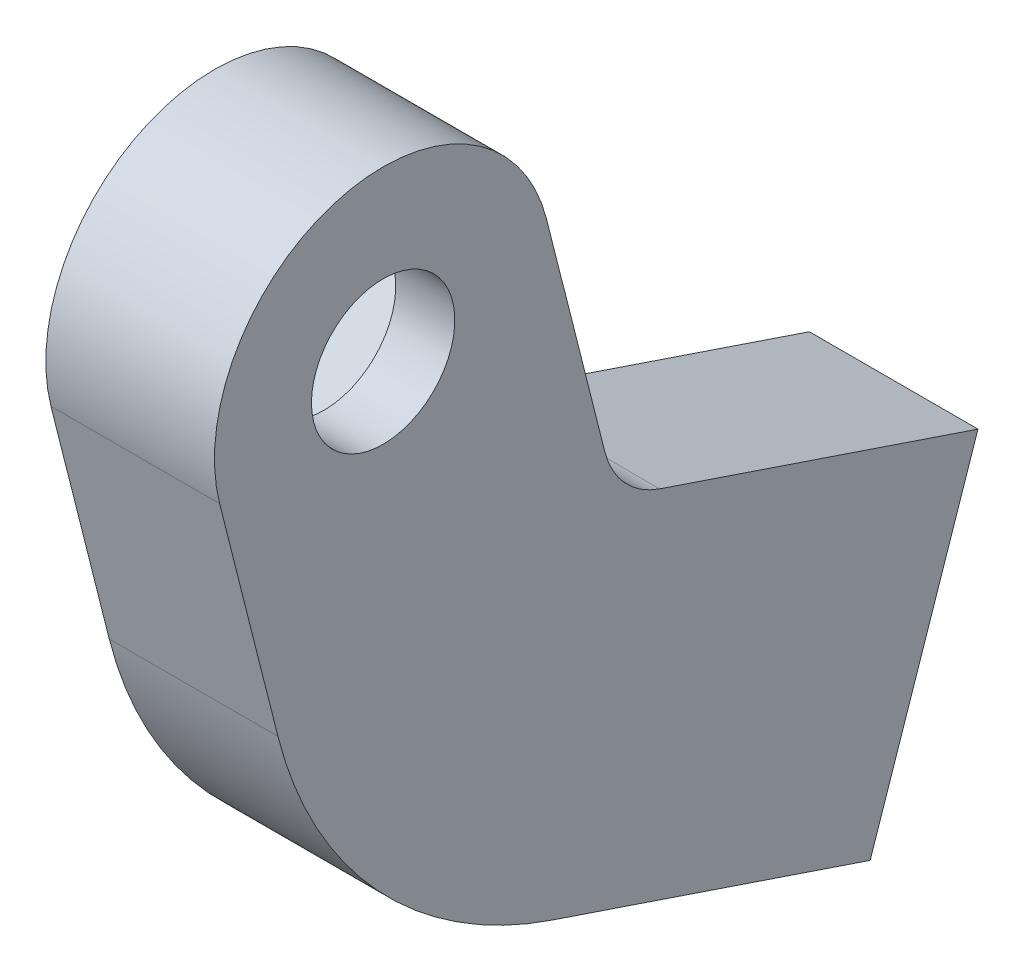
ISO-10303-21;
HEADER;
FILE_DESCRIPTION(('STEP AP214'),'2;1');
FILE_NAME('part.step','',(''),(''),'','','');
FILE_SCHEMA(('AUTOMOTIVE_DESIGN { 1 0 10303 214 1 1 1 1 }'));
ENDSEC;
DATA;
#1=APPLICATION_CONTEXT('core data for automotive mechanical design processes');
#2=APPLICATION_PROTOCOL_DEFINITION('international standard','automotive_design',2000,#1);
#3=PRODUCT_CONTEXT('',#1,'mechanical');
#4=PRODUCT('Part','Part','',(#3));
#5=PRODUCT_RELATED_PRODUCT_CATEGORY('part','',(#4));
#6=PRODUCT_DEFINITION_FORMATION('','',#4);
#7=PRODUCT_DEFINITION_CONTEXT('part definition',#1,'design');
#8=PRODUCT_DEFINITION('design','',#6,#7);
#9=PRODUCT_DEFINITION_SHAPE('','',#8);
#10=(LENGTH_UNIT() NAMED_UNIT(*) SI_UNIT(.MILLI.,.METRE.));
#11=(NAMED_UNIT(*) PLANE_ANGLE_UNIT() SI_UNIT($,.RADIAN.));
#12=(NAMED_UNIT(*) SI_UNIT($,.STERADIAN.) SOLID_ANGLE_UNIT());
#13=UNCERTAINTY_MEASURE_WITH_UNIT(LENGTH_MEASURE(1.E-05),#10,'distance_accuracy_value','');
#14=(GEOMETRIC_REPRESENTATION_CONTEXT(3) GLOBAL_UNCERTAINTY_ASSIGNED_CONTEXT((#13)) GLOBAL_UNIT_ASSIGNED_CONTEXT((#10,
#11,#12)) REPRESENTATION_CONTEXT('',''));
#15=CARTESIAN_POINT('',(0.,0.,0.));
#16=DIRECTION('',(0.,0.,1.));
#17=DIRECTION('',(1.,0.,0.));
#18=AXIS2_PLACEMENT_3D('',#15,#16,#17);
#19=CARTESIAN_POINT('',(0.,-17.2919678266991,-51.2425483606318));
#20=DIRECTION('',(0.,-0.319738933124525,-0.947505680534102));
#21=DIRECTION('',(0.,0.947505680534102,-0.319738933124525));
#22=AXIS2_PLACEMENT_3D('',#19,#20,#21);
#23=PLANE('',#22);
#24=DIRECTION('',(0.,0.947505680534102,-0.319738933124525));
#25=VECTOR('',#24,1.);
#26=CARTESIAN_POINT('',(43.4,-22.0388696828646,-49.6406905920519));
#27=LINE('',#26,#25);
#28=CARTESIAN_POINT('',(43.4,-42.4064718677847,-42.7675757108407));
#29=VERTEX_POINT('',#28);
#30=CARTESIAN_POINT('',(43.4,-34.8264264235118,-45.3254871758369));
#31=VERTEX_POINT('',#30);
#32=EDGE_CURVE('E54',#29,#31,#27,.T.);
#33=ORIENTED_EDGE('',*,*,#32,.F.);
#34=DIRECTION('',(1.,0.,0.));
#35=VECTOR('',#34,1.);
#36=CARTESIAN_POINT('',(43.402,-42.4064718677847,-42.7675757108407));
#37=LINE('',#36,#35);
#38=CARTESIAN_POINT('',(39.4,-42.4064718677847,-42.7675757108407));
#39=VERTEX_POINT('',#38);
#40=EDGE_CURVE('E74',#39,#29,#37,.T.);
#41=ORIENTED_EDGE('',*,*,#40,.F.);
#42=DIRECTION('',(0.,-0.947505680534102,0.319738933124525));
#43=VECTOR('',#42,1.);
#44=CARTESIAN_POINT('',(39.4,93.750311083211,-88.714133512878));
#45=LINE('',#44,#43);
#46=CARTESIAN_POINT('',(39.4,-34.8264264235118,-45.3254871758369));
#47=VERTEX_POINT('',#46);
#48=EDGE_CURVE('E411',#47,#39,#45,.T.);
#49=ORIENTED_EDGE('',*,*,#48,.F.);
#50=DIRECTION('',(1.,0.,0.));
#51=VECTOR('',#50,1.);
#52=CARTESIAN_POINT('',(43.402,-34.8264264235118,-45.3254871758369));
#53=LINE('',#52,#51);
#54=EDGE_CURVE('E12',#47,#31,#53,.T.);
#55=ORIENTED_EDGE('',*,*,#54,.T.);
#56=EDGE_LOOP('',(#33,#41,#49,#55));
#57=FACE_BOUND('',#56,.T.);
#58=ADVANCED_FACE('F51',(#57),#23,.T.);
#59=CARTESIAN_POINT('',(42.,0.,0.));
#60=DIRECTION('',(-1.,0.,0.));
#61=DIRECTION('',(0.,0.,1.));
#62=AXIS2_PLACEMENT_3D('',#59,#60,#61);
#63=PLANE('',#62);
#64=CARTESIAN_POINT('',(42.,-26.3840481603972,-31.2161670696051));
#65=DIRECTION('',(-1.,0.,0.));
#66=DIRECTION('',(0.,0.,1.));
#67=AXIS2_PLACEMENT_3D('',#64,#65,#66);
#68=CIRCLE('',#67,1.70000000000001);
#69=CARTESIAN_POINT('',(42.,-26.3840481603972,-29.5161670696051));
#70=VERTEX_POINT('',#69);
#71=EDGE_CURVE('E669',#70,#70,#68,.T.);
#72=ORIENTED_EDGE('',*,*,#71,.F.);
#73=EDGE_LOOP('',(#72));
#74=FACE_BOUND('',#73,.T.);
#75=DIRECTION('',(0.,0.969498490086454,0.24509728215565));
#76=VECTOR('',#75,1.);
#77=CARTESIAN_POINT('',(42.,-28.6778350250973,-28.8563912710748));
#78=LINE('',#77,#76);
#79=CARTESIAN_POINT('',(42.,-28.6778350250973,-28.8563912710748));
#80=VERTEX_POINT('',#79);
#81=CARTESIAN_POINT('',(42.,-25.4873158039843,-28.0498014746426));
#82=VERTEX_POINT('',#81);
#83=EDGE_CURVE('E158',#80,#82,#78,.T.);
#84=ORIENTED_EDGE('',*,*,#83,.T.);
#85=DIRECTION('',(0.,0.697009717788526,-0.717061680267715));
#86=VECTOR('',#85,1.);
#87=CARTESIAN_POINT('',(42.,-25.4873158039843,-28.0498014746426));
#88=LINE('',#87,#86);
#89=CARTESIAN_POINT('',(42.,-23.1935289392843,-30.4095772731729));
#90=VERTEX_POINT('',#89);
#91=EDGE_CURVE('E169',#82,#90,#88,.T.);
#92=ORIENTED_EDGE('',*,*,#91,.T.);
#93=DIRECTION('',(0.,-0.272488772297912,-0.962158962423349));
#94=VECTOR('',#93,1.);
#95=CARTESIAN_POINT('',(42.,-23.1935289392843,-30.4095772731729));
#96=LINE('',#95,#94);
#97=CARTESIAN_POINT('',(42.,-24.0902612956972,-33.5759428681354));
#98=VERTEX_POINT('',#97);
#99=EDGE_CURVE('E174',#90,#98,#96,.T.);
#100=ORIENTED_EDGE('',*,*,#99,.T.);
#101=DIRECTION('',(0.,-0.969498490086455,-0.245097282155643));
#102=VECTOR('',#101,1.);
#103=CARTESIAN_POINT('',(42.,-24.0902612956972,-33.5759428681354));
#104=LINE('',#103,#102);
#105=CARTESIAN_POINT('',(42.,-27.2807805168103,-34.3825326645676));
#106=VERTEX_POINT('',#105);
#107=EDGE_CURVE('E189',#98,#106,#104,.T.);
#108=ORIENTED_EDGE('',*,*,#107,.T.);
#109=DIRECTION('',(0.,-0.697009717788511,0.71706168026773));
#110=VECTOR('',#109,1.);
#111=CARTESIAN_POINT('',(42.,-27.2807805168103,-34.3825326645676));
#112=LINE('',#111,#110);
#113=CARTESIAN_POINT('',(42.,-29.5745673815104,-32.0227568660371));
#114=VERTEX_POINT('',#113);
#115=EDGE_CURVE('E192',#106,#114,#112,.T.);
#116=ORIENTED_EDGE('',*,*,#115,.T.);
#117=DIRECTION('',(0.,0.272488772297985,0.962158962423329));
#118=VECTOR('',#117,1.);
#119=CARTESIAN_POINT('',(42.,-29.5745673815104,-32.0227568660371));
#120=LINE('',#119,#118);
#121=EDGE_CURVE('E166',#114,#80,#120,.T.);
#122=ORIENTED_EDGE('',*,*,#121,.T.);
#123=EDGE_LOOP('',(#84,#92,#100,#108,#116,#122));
#124=FACE_BOUND('',#123,.T.);
#125=ADVANCED_FACE('F176',(#74,#124),#63,.T.);
#126=CARTESIAN_POINT('',(42.,-26.3840481603972,-31.2161670696051));
#127=DIRECTION('',(-1.,0.,0.));
#128=DIRECTION('',(0.,0.,1.));
#129=AXIS2_PLACEMENT_3D('',#126,#127,#128);
#130=CYLINDRICAL_SURFACE('',#129,1.70000000000001);
#131=CARTESIAN_POINT('',(43.4,-26.3840481603972,-31.2161670696051));
#132=DIRECTION('',(-1.,0.,0.));
#133=DIRECTION('',(0.,0.,1.));
#134=AXIS2_PLACEMENT_3D('',#131,#132,#133);
#135=CIRCLE('',#134,1.70000000000001);
#136=CARTESIAN_POINT('',(43.4,-26.3840481603972,-29.5161670696051));
#137=VERTEX_POINT('',#136);
#138=EDGE_CURVE('E185',#137,#137,#135,.T.);
#139=ORIENTED_EDGE('',*,*,#138,.F.);
#140=EDGE_LOOP('',(#139));
#141=FACE_BOUND('',#140,.T.);
#142=ORIENTED_EDGE('',*,*,#71,.T.);
#143=EDGE_LOOP('',(#142));
#144=FACE_BOUND('',#143,.T.);
#145=ADVANCED_FACE('F499',(#141,#144),#130,.F.);
#146=CARTESIAN_POINT('',(43.4,-20.2560833651572,-44.357629981637));
#147=DIRECTION('',(1.,0.,0.));
#148=DIRECTION('',(0.,0.,1.));
#149=AXIS2_PLACEMENT_3D('',#146,#147,#148);
#150=PLANE('',#149);
#151=ORIENTED_EDGE('',*,*,#138,.T.);
#152=EDGE_LOOP('',(#151));
#153=FACE_BOUND('',#152,.T.);
#154=DIRECTION('',(0.,0.319738933124525,0.947505680534101));
#155=VECTOR('',#154,1.);
#156=CARTESIAN_POINT('',(43.4,-43.2975754711236,-45.4082479550907));
#157=LINE('',#156,#155);
#158=CARTESIAN_POINT('',(43.4,-39.8591049657382,-35.2187777383598));
#159=VERTEX_POINT('',#158);
#160=EDGE_CURVE('E378',#29,#159,#157,.T.);
#161=ORIENTED_EDGE('',*,*,#160,.F.);
#162=ORIENTED_EDGE('',*,*,#32,.T.);
#163=DIRECTION('',(0.,0.319738933124525,0.947505680534101));
#164=VECTOR('',#163,1.);
#165=CARTESIAN_POINT('',(43.4,-35.7175300268508,-47.966159420087));
#166=LINE('',#165,#164);
#167=CARTESIAN_POINT('',(43.4,-32.2790595214654,-37.7766892033561));
#168=VERTEX_POINT('',#167);
#169=EDGE_CURVE('E66',#31,#168,#166,.T.);
#170=ORIENTED_EDGE('',*,*,#169,.T.);
#171=CARTESIAN_POINT('',(43.4,-30.3840481603972,-38.4161670696052));
#172=DIRECTION('',(1.,0.,0.));
#173=DIRECTION('',(0.,0.,-1.));
#174=AXIS2_PLACEMENT_3D('',#171,#172,#173);
#175=CIRCLE('',#174,2.);
#176=CARTESIAN_POINT('',(43.4,-30.8742427247084,-36.4771700894322));
#177=VERTEX_POINT('',#176);
#178=EDGE_CURVE('E426',#168,#177,#175,.F.);
#179=ORIENTED_EDGE('',*,*,#178,.T.);
#180=DIRECTION('',(0.,0.969498490086459,0.245097282155628));
#181=VECTOR('',#180,1.);
#182=CARTESIAN_POINT('',(43.4,-28.1389508782415,-35.7856655596916));
#183=LINE('',#182,#181);
#184=CARTESIAN_POINT('',(43.4,-25.4036590317746,-35.0941610299509));
#185=VERTEX_POINT('',#184);
#186=EDGE_CURVE('E359',#177,#185,#183,.T.);
#187=ORIENTED_EDGE('',*,*,#186,.T.);
#188=CARTESIAN_POINT('',(43.4,-26.3840481603972,-31.2161670696051));
#189=DIRECTION('',(-1.,0.,0.));
#190=DIRECTION('',(0.,0.,-1.));
#191=AXIS2_PLACEMENT_3D('',#188,#189,#190);
#192=CIRCLE('',#191,4.);
#193=CARTESIAN_POINT('',(43.4,-27.3644372890197,-27.3381731092592));
#194=VERTEX_POINT('',#193);
#195=EDGE_CURVE('E368',#194,#185,#192,.T.);
#196=ORIENTED_EDGE('',*,*,#195,.F.);
#197=DIRECTION('',(0.,0.969498490086459,0.245097282155629));
#198=VECTOR('',#197,1.);
#199=CARTESIAN_POINT('',(43.4,-30.0997291354866,-28.0296776389998));
#200=LINE('',#199,#198);
#201=CARTESIAN_POINT('',(43.4,-32.8350209819534,-28.7211821687404));
#202=VERTEX_POINT('',#201);
#203=EDGE_CURVE('E374',#202,#194,#200,.T.);
#204=ORIENTED_EDGE('',*,*,#203,.F.);
#205=CARTESIAN_POINT('',(43.4,-30.3840481603971,-38.416167069605));
#206=DIRECTION('',(1.,0.,0.));
#207=DIRECTION('',(0.,0.,-1.));
#208=AXIS2_PLACEMENT_3D('',#205,#206,#207);
#209=CIRCLE('',#208,10.);
#210=EDGE_CURVE('E414',#202,#159,#209,.T.);
#211=ORIENTED_EDGE('',*,*,#210,.T.);
#212=EDGE_LOOP('',(#161,#162,#170,#179,#187,#196,#204,#211));
#213=FACE_BOUND('',#212,.T.);
#214=ADVANCED_FACE('F442',(#153,#213),#150,.T.);
#215=CARTESIAN_POINT('',(43.402,-30.3840481603972,-38.4161670696052));
#216=DIRECTION('',(-1.,0.,0.));
#217=DIRECTION('',(0.,0.,1.));
#218=AXIS2_PLACEMENT_3D('',#215,#216,#217);
#219=CYLINDRICAL_SURFACE('',#218,2.);
#220=CARTESIAN_POINT('',(39.4,-30.3840481603972,-38.4161670696052));
#221=DIRECTION('',(-1.,0.,0.));
#222=DIRECTION('',(0.,-1.,0.));
#223=AXIS2_PLACEMENT_3D('',#220,#221,#222);
#224=CIRCLE('',#223,2.);
#225=CARTESIAN_POINT('',(39.4,-30.8742427247084,-36.4771700894322));
#226=VERTEX_POINT('',#225);
#227=CARTESIAN_POINT('',(39.4,-32.2790595214654,-37.7766892033561));
#228=VERTEX_POINT('',#227);
#229=EDGE_CURVE('E424',#226,#228,#224,.F.);
#230=ORIENTED_EDGE('',*,*,#229,.F.);
#231=DIRECTION('',(1.,0.,0.));
#232=VECTOR('',#231,1.);
#233=CARTESIAN_POINT('',(39.4,-30.8742427247084,-36.4771700894322));
#234=LINE('',#233,#232);
#235=EDGE_CURVE('E427',#177,#226,#234,.F.);
#236=ORIENTED_EDGE('',*,*,#235,.F.);
#237=ORIENTED_EDGE('',*,*,#178,.F.);
#238=DIRECTION('',(1.,0.,0.));
#239=VECTOR('',#238,1.);
#240=CARTESIAN_POINT('',(43.4,-32.2790595214654,-37.7766892033561));
#241=LINE('',#240,#239);
#242=EDGE_CURVE('E379',#228,#168,#241,.T.);
#243=ORIENTED_EDGE('',*,*,#242,.F.);
#244=EDGE_LOOP('',(#230,#236,#237,#243));
#245=FACE_BOUND('',#244,.T.);
#246=ADVANCED_FACE('F454',(#245),#219,.F.);
#247=CARTESIAN_POINT('',(43.402,-28.1389508782415,-35.7856655596916));
#248=DIRECTION('',(0.,-0.245097282155628,0.969498490086459));
#249=DIRECTION('',(-1.,0.,0.));
#250=AXIS2_PLACEMENT_3D('',#247,#248,#249);
#251=PLANE('',#250);
#252=ORIENTED_EDGE('',*,*,#186,.F.);
#253=ORIENTED_EDGE('',*,*,#235,.T.);
#254=DIRECTION('',(0.,-0.969498490086459,-0.245097282155628));
#255=VECTOR('',#254,1.);
#256=CARTESIAN_POINT('',(39.4,-28.1389508782415,-35.7856655596916));
#257=LINE('',#256,#255);
#258=CARTESIAN_POINT('',(39.4,-25.4036590317746,-35.0941610299509));
#259=VERTEX_POINT('',#258);
#260=EDGE_CURVE('E253',#259,#226,#257,.T.);
#261=ORIENTED_EDGE('',*,*,#260,.F.);
#262=DIRECTION('',(-1.,0.,0.));
#263=VECTOR('',#262,1.);
#264=CARTESIAN_POINT('',(43.402,-25.4036590317746,-35.0941610299509));
#265=LINE('',#264,#263);
#266=EDGE_CURVE('E364',#185,#259,#265,.T.);
#267=ORIENTED_EDGE('',*,*,#266,.F.);
#268=EDGE_LOOP('',(#252,#253,#261,#267));
#269=FACE_BOUND('',#268,.T.);
#270=ADVANCED_FACE('F456',(#269),#251,.F.);
#271=CARTESIAN_POINT('',(43.402,-26.3840481603972,-31.2161670696051));
#272=DIRECTION('',(-1.,0.,0.));
#273=DIRECTION('',(0.,0.,1.));
#274=AXIS2_PLACEMENT_3D('',#271,#272,#273);
#275=CYLINDRICAL_SURFACE('',#274,4.);
#276=CARTESIAN_POINT('',(39.4,-26.3840481603972,-31.2161670696051));
#277=DIRECTION('',(1.,0.,0.));
#278=DIRECTION('',(0.,-1.,0.));
#279=AXIS2_PLACEMENT_3D('',#276,#277,#278);
#280=CIRCLE('',#279,4.);
#281=CARTESIAN_POINT('',(39.4,-27.3644372890197,-27.3381731092592));
#282=VERTEX_POINT('',#281);
#283=EDGE_CURVE('E259',#259,#282,#280,.T.);
#284=ORIENTED_EDGE('',*,*,#283,.T.);
#285=DIRECTION('',(-1.,0.,0.));
#286=VECTOR('',#285,1.);
#287=CARTESIAN_POINT('',(43.402,-27.3644372890197,-27.3381731092592));
#288=LINE('',#287,#286);
#289=EDGE_CURVE('E363',#194,#282,#288,.T.);
#290=ORIENTED_EDGE('',*,*,#289,.F.);
#291=ORIENTED_EDGE('',*,*,#195,.T.);
#292=ORIENTED_EDGE('',*,*,#266,.T.);
#293=EDGE_LOOP('',(#284,#290,#291,#292));
#294=FACE_BOUND('',#293,.T.);
#295=ADVANCED_FACE('F450',(#294),#275,.T.);
#296=CARTESIAN_POINT('',(43.402,-30.0997291354866,-28.0296776389998));
#297=DIRECTION('',(0.,-0.245097282155629,0.969498490086459));
#298=DIRECTION('',(-1.,0.,0.));
#299=AXIS2_PLACEMENT_3D('',#296,#297,#298);
#300=PLANE('',#299);
#301=DIRECTION('',(0.,-0.969498490086459,-0.245097282155629));
#302=VECTOR('',#301,1.);
#303=CARTESIAN_POINT('',(39.4,-30.0997291354866,-28.0296776389998));
#304=LINE('',#303,#302);
#305=CARTESIAN_POINT('',(39.4,-32.8350209819534,-28.7211821687404));
#306=VERTEX_POINT('',#305);
#307=EDGE_CURVE('E391',#282,#306,#304,.T.);
#308=ORIENTED_EDGE('',*,*,#307,.T.);
#309=DIRECTION('',(-1.,0.,0.));
#310=VECTOR('',#309,1.);
#311=CARTESIAN_POINT('',(43.402,-32.8350209819534,-28.7211821687404));
#312=LINE('',#311,#310);
#313=EDGE_CURVE('E420',#306,#202,#312,.F.);
#314=ORIENTED_EDGE('',*,*,#313,.T.);
#315=ORIENTED_EDGE('',*,*,#203,.T.);
#316=ORIENTED_EDGE('',*,*,#289,.T.);
#317=EDGE_LOOP('',(#308,#314,#315,#316));
#318=FACE_BOUND('',#317,.T.);
#319=ADVANCED_FACE('F446',(#318),#300,.T.);
#320=CARTESIAN_POINT('',(43.402,-30.3840481603971,-38.416167069605));
#321=DIRECTION('',(-1.,0.,0.));
#322=DIRECTION('',(0.,0.,1.));
#323=AXIS2_PLACEMENT_3D('',#320,#321,#322);
#324=CYLINDRICAL_SURFACE('',#323,10.);
#325=ORIENTED_EDGE('',*,*,#210,.F.);
#326=ORIENTED_EDGE('',*,*,#313,.F.);
#327=CARTESIAN_POINT('',(39.4,-30.3840481603971,-38.416167069605));
#328=DIRECTION('',(-1.,0.,0.));
#329=DIRECTION('',(0.,-1.,0.));
#330=AXIS2_PLACEMENT_3D('',#327,#328,#329);
#331=CIRCLE('',#330,10.);
#332=CARTESIAN_POINT('',(39.4,-39.8591049657382,-35.2187777383598));
#333=VERTEX_POINT('',#332);
#334=EDGE_CURVE('E410',#333,#306,#331,.T.);
#335=ORIENTED_EDGE('',*,*,#334,.F.);
#336=DIRECTION('',(-1.,0.,0.));
#337=VECTOR('',#336,1.);
#338=CARTESIAN_POINT('',(43.402,-39.8591049657382,-35.2187777383598));
#339=LINE('',#338,#337);
#340=EDGE_CURVE('E407',#159,#333,#339,.T.);
#341=ORIENTED_EDGE('',*,*,#340,.F.);
#342=EDGE_LOOP('',(#325,#326,#335,#341));
#343=FACE_BOUND('',#342,.T.);
#344=ADVANCED_FACE('F445',(#343),#324,.T.);
#345=CARTESIAN_POINT('',(43.402,-43.2975754711236,-45.4082479550907));
#346=DIRECTION('',(0.,-0.947505680534101,0.319738933124525));
#347=DIRECTION('',(-1.,0.,0.));
#348=AXIS2_PLACEMENT_3D('',#345,#346,#347);
#349=PLANE('',#348);
#350=DIRECTION('',(0.,-0.319738933124525,-0.947505680534101));
#351=VECTOR('',#350,1.);
#352=CARTESIAN_POINT('',(39.4,-43.2975754711236,-45.4082479550907));
#353=LINE('',#352,#351);
#354=EDGE_CURVE('E220',#333,#39,#353,.T.);
#355=ORIENTED_EDGE('',*,*,#354,.T.);
#356=ORIENTED_EDGE('',*,*,#40,.T.);
#357=ORIENTED_EDGE('',*,*,#160,.T.);
#358=ORIENTED_EDGE('',*,*,#340,.T.);
#359=EDGE_LOOP('',(#355,#356,#357,#358));
#360=FACE_BOUND('',#359,.T.);
#361=ADVANCED_FACE('F405',(#360),#349,.T.);
#362=CARTESIAN_POINT('',(43.402,-35.7175300268508,-47.966159420087));
#363=DIRECTION('',(0.,-0.947505680534102,0.319738933124524));
#364=DIRECTION('',(-1.,0.,0.));
#365=AXIS2_PLACEMENT_3D('',#362,#363,#364);
#366=PLANE('',#365);
#367=ORIENTED_EDGE('',*,*,#54,.F.);
#368=DIRECTION('',(0.,-0.319738933124525,-0.947505680534101));
#369=VECTOR('',#368,1.);
#370=CARTESIAN_POINT('',(39.4,-35.7175300268508,-47.966159420087));
#371=LINE('',#370,#369);
#372=EDGE_CURVE('E208',#228,#47,#371,.T.);
#373=ORIENTED_EDGE('',*,*,#372,.F.);
#374=ORIENTED_EDGE('',*,*,#242,.T.);
#375=ORIENTED_EDGE('',*,*,#169,.F.);
#376=EDGE_LOOP('',(#367,#373,#374,#375));
#377=FACE_BOUND('',#376,.T.);
#378=ADVANCED_FACE('F465',(#377),#366,.F.);
#379=CARTESIAN_POINT('',(42.,-25.4873158039843,-28.0498014746426));
#380=DIRECTION('',(0.,0.717061680267715,0.697009717788526));
#381=DIRECTION('',(0.,-0.697009717788526,0.717061680267715));
#382=AXIS2_PLACEMENT_3D('',#379,#380,#381);
#383=PLANE('',#382);
#384=DIRECTION('',(0.,0.697009717788526,-0.717061680267715));
#385=VECTOR('',#384,1.);
#386=CARTESIAN_POINT('',(39.4,-25.4873158039843,-28.0498014746426));
#387=LINE('',#386,#385);
#388=CARTESIAN_POINT('',(39.4,-25.4873158039843,-28.0498014746426));
#389=VERTEX_POINT('',#388);
#390=CARTESIAN_POINT('',(39.4,-23.1935289392843,-30.4095772731729));
#391=VERTEX_POINT('',#390);
#392=EDGE_CURVE('E196',#389,#391,#387,.T.);
#393=ORIENTED_EDGE('',*,*,#392,.T.);
#394=DIRECTION('',(-1.,0.,0.));
#395=VECTOR('',#394,1.);
#396=CARTESIAN_POINT('',(42.,-23.1935289392843,-30.4095772731729));
#397=LINE('',#396,#395);
#398=EDGE_CURVE('E165',#90,#391,#397,.T.);
#399=ORIENTED_EDGE('',*,*,#398,.F.);
#400=ORIENTED_EDGE('',*,*,#91,.F.);
#401=DIRECTION('',(-1.,0.,0.));
#402=VECTOR('',#401,1.);
#403=CARTESIAN_POINT('',(42.,-25.4873158039843,-28.0498014746426));
#404=LINE('',#403,#402);
#405=EDGE_CURVE('E154',#82,#389,#404,.T.);
#406=ORIENTED_EDGE('',*,*,#405,.T.);
#407=EDGE_LOOP('',(#393,#399,#400,#406));
#408=FACE_BOUND('',#407,.T.);
#409=ADVANCED_FACE('F170',(#408),#383,.F.);
#410=CARTESIAN_POINT('',(42.,-23.1935289392843,-30.4095772731729));
#411=DIRECTION('',(0.,0.96215896242335,-0.272488772297912));
#412=DIRECTION('',(0.,0.272488772297912,0.96215896242335));
#413=AXIS2_PLACEMENT_3D('',#410,#411,#412);
#414=PLANE('',#413);
#415=DIRECTION('',(0.,-0.272488772297912,-0.962158962423349));
#416=VECTOR('',#415,1.);
#417=CARTESIAN_POINT('',(39.4,-23.1935289392843,-30.4095772731729));
#418=LINE('',#417,#416);
#419=CARTESIAN_POINT('',(39.4,-24.0902612956972,-33.5759428681354));
#420=VERTEX_POINT('',#419);
#421=EDGE_CURVE('E198',#391,#420,#418,.T.);
#422=ORIENTED_EDGE('',*,*,#421,.T.);
#423=DIRECTION('',(-1.,0.,0.));
#424=VECTOR('',#423,1.);
#425=CARTESIAN_POINT('',(42.,-24.0902612956972,-33.5759428681354));
#426=LINE('',#425,#424);
#427=EDGE_CURVE('E213',#98,#420,#426,.T.);
#428=ORIENTED_EDGE('',*,*,#427,.F.);
#429=ORIENTED_EDGE('',*,*,#99,.F.);
#430=ORIENTED_EDGE('',*,*,#398,.T.);
#431=EDGE_LOOP('',(#422,#428,#429,#430));
#432=FACE_BOUND('',#431,.T.);
#433=ADVANCED_FACE('F542',(#432),#414,.F.);
#434=CARTESIAN_POINT('',(42.,-24.0902612956972,-33.5759428681354));
#435=DIRECTION('',(0.,0.245097282155643,-0.969498490086455));
#436=DIRECTION('',(0.,0.969498490086455,0.245097282155643));
#437=AXIS2_PLACEMENT_3D('',#434,#435,#436);
#438=PLANE('',#437);
#439=DIRECTION('',(0.,-0.969498490086455,-0.245097282155643));
#440=VECTOR('',#439,1.);
#441=CARTESIAN_POINT('',(39.4,-24.0902612956972,-33.5759428681354));
#442=LINE('',#441,#440);
#443=CARTESIAN_POINT('',(39.4,-27.2807805168103,-34.3825326645676));
#444=VERTEX_POINT('',#443);
#445=EDGE_CURVE('E201',#420,#444,#442,.T.);
#446=ORIENTED_EDGE('',*,*,#445,.T.);
#447=DIRECTION('',(-1.,0.,0.));
#448=VECTOR('',#447,1.);
#449=CARTESIAN_POINT('',(42.,-27.2807805168103,-34.3825326645676));
#450=LINE('',#449,#448);
#451=EDGE_CURVE('E211',#106,#444,#450,.T.);
#452=ORIENTED_EDGE('',*,*,#451,.F.);
#453=ORIENTED_EDGE('',*,*,#107,.F.);
#454=ORIENTED_EDGE('',*,*,#427,.T.);
#455=EDGE_LOOP('',(#446,#452,#453,#454));
#456=FACE_BOUND('',#455,.T.);
#457=ADVANCED_FACE('F531',(#456),#438,.F.);
#458=CARTESIAN_POINT('',(42.,-27.2807805168103,-34.3825326645676));
#459=DIRECTION('',(0.,-0.71706168026773,-0.697009717788511));
#460=DIRECTION('',(0.,0.697009717788511,-0.71706168026773));
#461=AXIS2_PLACEMENT_3D('',#458,#459,#460);
#462=PLANE('',#461);
#463=DIRECTION('',(0.,-0.697009717788511,0.71706168026773));
#464=VECTOR('',#463,1.);
#465=CARTESIAN_POINT('',(39.4,-27.2807805168103,-34.3825326645676));
#466=LINE('',#465,#464);
#467=CARTESIAN_POINT('',(39.4,-29.5745673815104,-32.0227568660371));
#468=VERTEX_POINT('',#467);
#469=EDGE_CURVE('E182',#444,#468,#466,.T.);
#470=ORIENTED_EDGE('',*,*,#469,.T.);
#471=DIRECTION('',(-1.,0.,0.));
#472=VECTOR('',#471,1.);
#473=CARTESIAN_POINT('',(42.,-29.5745673815104,-32.0227568660371));
#474=LINE('',#473,#472);
#475=EDGE_CURVE('E209',#114,#468,#474,.T.);
#476=ORIENTED_EDGE('',*,*,#475,.F.);
#477=ORIENTED_EDGE('',*,*,#115,.F.);
#478=ORIENTED_EDGE('',*,*,#451,.T.);
#479=EDGE_LOOP('',(#470,#476,#477,#478));
#480=FACE_BOUND('',#479,.T.);
#481=ADVANCED_FACE('F520',(#480),#462,.F.);
#482=CARTESIAN_POINT('',(42.,-29.5745673815104,-32.0227568660371));
#483=DIRECTION('',(0.,-0.962158962423329,0.272488772297985));
#484=DIRECTION('',(0.,-0.272488772297985,-0.962158962423329));
#485=AXIS2_PLACEMENT_3D('',#482,#483,#484);
#486=PLANE('',#485);
#487=DIRECTION('',(0.,0.272488772297985,0.962158962423329));
#488=VECTOR('',#487,1.);
#489=CARTESIAN_POINT('',(39.4,-29.5745673815104,-32.0227568660371));
#490=LINE('',#489,#488);
#491=CARTESIAN_POINT('',(39.4,-28.6778350250973,-28.8563912710748));
#492=VERTEX_POINT('',#491);
#493=EDGE_CURVE('E179',#468,#492,#490,.T.);
#494=ORIENTED_EDGE('',*,*,#493,.T.);
#495=DIRECTION('',(-1.,0.,0.));
#496=VECTOR('',#495,1.);
#497=CARTESIAN_POINT('',(42.,-28.6778350250973,-28.8563912710748));
#498=LINE('',#497,#496);
#499=EDGE_CURVE('E206',#80,#492,#498,.T.);
#500=ORIENTED_EDGE('',*,*,#499,.F.);
#501=ORIENTED_EDGE('',*,*,#121,.F.);
#502=ORIENTED_EDGE('',*,*,#475,.T.);
#503=EDGE_LOOP('',(#494,#500,#501,#502));
#504=FACE_BOUND('',#503,.T.);
#505=ADVANCED_FACE('F487',(#504),#486,.F.);
#506=CARTESIAN_POINT('',(42.,-28.6778350250973,-28.8563912710748));
#507=DIRECTION('',(0.,-0.24509728215565,0.969498490086454));
#508=DIRECTION('',(0.,-0.969498490086454,-0.24509728215565));
#509=AXIS2_PLACEMENT_3D('',#506,#507,#508);
#510=PLANE('',#509);
#511=DIRECTION('',(0.,0.969498490086454,0.24509728215565));
#512=VECTOR('',#511,1.);
#513=CARTESIAN_POINT('',(39.4,-28.6778350250973,-28.8563912710748));
#514=LINE('',#513,#512);
#515=EDGE_CURVE('E161',#492,#389,#514,.T.);
#516=ORIENTED_EDGE('',*,*,#515,.T.);
#517=ORIENTED_EDGE('',*,*,#405,.F.);
#518=ORIENTED_EDGE('',*,*,#83,.F.);
#519=ORIENTED_EDGE('',*,*,#499,.T.);
#520=EDGE_LOOP('',(#516,#517,#518,#519));
#521=FACE_BOUND('',#520,.T.);
#522=ADVANCED_FACE('F156',(#521),#510,.F.);
#523=CARTESIAN_POINT('',(39.4,95.3339005591029,-84.0213674196815));
#524=DIRECTION('',(-1.,0.,0.));
#525=DIRECTION('',(0.,0.,1.));
#526=AXIS2_PLACEMENT_3D('',#523,#524,#525);
#527=PLANE('',#526);
#528=ORIENTED_EDGE('',*,*,#515,.F.);
#529=ORIENTED_EDGE('',*,*,#493,.F.);
#530=ORIENTED_EDGE('',*,*,#469,.F.);
#531=ORIENTED_EDGE('',*,*,#445,.F.);
#532=ORIENTED_EDGE('',*,*,#421,.F.);
#533=ORIENTED_EDGE('',*,*,#392,.F.);
#534=EDGE_LOOP('',(#528,#529,#530,#531,#532,#533));
#535=FACE_BOUND('',#534,.T.);
#536=ORIENTED_EDGE('',*,*,#372,.T.);
#537=ORIENTED_EDGE('',*,*,#48,.T.);
#538=ORIENTED_EDGE('',*,*,#354,.F.);
#539=ORIENTED_EDGE('',*,*,#334,.T.);
#540=ORIENTED_EDGE('',*,*,#307,.F.);
#541=ORIENTED_EDGE('',*,*,#283,.F.);
#542=ORIENTED_EDGE('',*,*,#260,.T.);
#543=ORIENTED_EDGE('',*,*,#229,.T.);
#544=EDGE_LOOP('',(#536,#537,#538,#539,#540,#541,#542,#543));
#545=FACE_BOUND('',#544,.T.);
#546=ADVANCED_FACE('F409',(#535,#545),#527,.T.);
#547=CLOSED_SHELL('',(#58,#125,#145,#214,#246,#270,#295,#319,#344,#361,#378,#409,#433,#457,#481,
#505,#522,#546));
#548=MANIFOLD_SOLID_BREP('B2',#547);
#549=ADVANCED_BREP_SHAPE_REPRESENTATION('',(#18,#548),#14);
#550=SHAPE_DEFINITION_REPRESENTATION(#9,#549);
ENDSEC;
END-ISO-10303-21;
